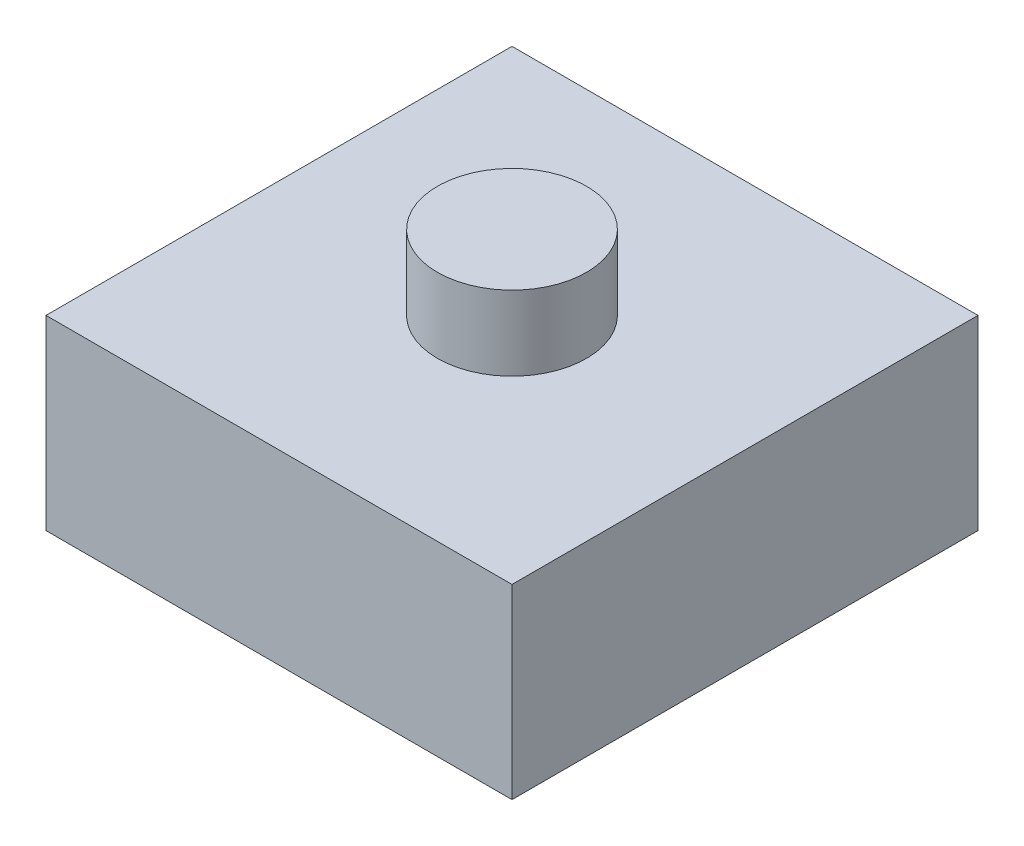
ISO-10303-21;
HEADER;
FILE_DESCRIPTION(('STEP AP214'),'2;1');
FILE_NAME('part.step','',(''),(''),'','','');
FILE_SCHEMA(('AUTOMOTIVE_DESIGN { 1 0 10303 214 1 1 1 1 }'));
ENDSEC;
DATA;
#1=APPLICATION_CONTEXT('core data for automotive mechanical design processes');
#2=APPLICATION_PROTOCOL_DEFINITION('international standard','automotive_design',2000,#1);
#3=PRODUCT_CONTEXT('',#1,'mechanical');
#4=PRODUCT('Part','Part','',(#3));
#5=PRODUCT_RELATED_PRODUCT_CATEGORY('part','',(#4));
#6=PRODUCT_DEFINITION_FORMATION('','',#4);
#7=PRODUCT_DEFINITION_CONTEXT('part definition',#1,'design');
#8=PRODUCT_DEFINITION('design','',#6,#7);
#9=PRODUCT_DEFINITION_SHAPE('','',#8);
#10=(LENGTH_UNIT() NAMED_UNIT(*) SI_UNIT(.MILLI.,.METRE.));
#11=(NAMED_UNIT(*) PLANE_ANGLE_UNIT() SI_UNIT($,.RADIAN.));
#12=(NAMED_UNIT(*) SI_UNIT($,.STERADIAN.) SOLID_ANGLE_UNIT());
#13=UNCERTAINTY_MEASURE_WITH_UNIT(LENGTH_MEASURE(1.E-05),#10,'distance_accuracy_value','');
#14=(GEOMETRIC_REPRESENTATION_CONTEXT(3) GLOBAL_UNCERTAINTY_ASSIGNED_CONTEXT((#13)) GLOBAL_UNIT_ASSIGNED_CONTEXT((#10,
#11,#12)) REPRESENTATION_CONTEXT('',''));
#15=CARTESIAN_POINT('',(0.,0.,0.));
#16=DIRECTION('',(0.,0.,1.));
#17=DIRECTION('',(1.,0.,0.));
#18=AXIS2_PLACEMENT_3D('',#15,#16,#17);
#19=CARTESIAN_POINT('',(12.5,10.,12.5));
#20=DIRECTION('',(-1.,0.,0.));
#21=DIRECTION('',(0.,0.,1.));
#22=AXIS2_PLACEMENT_3D('',#19,#20,#21);
#23=PLANE('',#22);
#24=DIRECTION('',(0.,0.,-1.));
#25=VECTOR('',#24,1.);
#26=CARTESIAN_POINT('',(12.5,0.,12.5));
#27=LINE('',#26,#25);
#28=CARTESIAN_POINT('',(12.5,0.,12.5));
#29=VERTEX_POINT('',#28);
#30=CARTESIAN_POINT('',(12.5,0.,-12.5));
#31=VERTEX_POINT('',#30);
#32=EDGE_CURVE('E98',#29,#31,#27,.T.);
#33=ORIENTED_EDGE('',*,*,#32,.T.);
#34=DIRECTION('',(0.,-1.,0.));
#35=VECTOR('',#34,1.);
#36=CARTESIAN_POINT('',(12.5,10.,-12.5));
#37=LINE('',#36,#35);
#38=CARTESIAN_POINT('',(12.5,10.,-12.5));
#39=VERTEX_POINT('',#38);
#40=EDGE_CURVE('E35',#39,#31,#37,.T.);
#41=ORIENTED_EDGE('',*,*,#40,.F.);
#42=DIRECTION('',(0.,0.,-1.));
#43=VECTOR('',#42,1.);
#44=CARTESIAN_POINT('',(12.5,10.,12.5));
#45=LINE('',#44,#43);
#46=CARTESIAN_POINT('',(12.5,10.,12.5));
#47=VERTEX_POINT('',#46);
#48=EDGE_CURVE('E85',#47,#39,#45,.T.);
#49=ORIENTED_EDGE('',*,*,#48,.F.);
#50=DIRECTION('',(0.,-1.,0.));
#51=VECTOR('',#50,1.);
#52=CARTESIAN_POINT('',(12.5,10.,12.5));
#53=LINE('',#52,#51);
#54=EDGE_CURVE('E94',#47,#29,#53,.T.);
#55=ORIENTED_EDGE('',*,*,#54,.T.);
#56=EDGE_LOOP('',(#33,#41,#49,#55));
#57=FACE_BOUND('',#56,.T.);
#58=ADVANCED_FACE('F32',(#57),#23,.F.);
#59=CARTESIAN_POINT('',(-12.5,10.,-12.5));
#60=DIRECTION('',(0.,0.,1.));
#61=DIRECTION('',(1.,0.,0.));
#62=AXIS2_PLACEMENT_3D('',#59,#60,#61);
#63=PLANE('',#62);
#64=DIRECTION('',(-1.,0.,0.));
#65=VECTOR('',#64,1.);
#66=CARTESIAN_POINT('',(-12.5,0.,-12.5));
#67=LINE('',#66,#65);
#68=CARTESIAN_POINT('',(-12.5,0.,-12.5));
#69=VERTEX_POINT('',#68);
#70=EDGE_CURVE('E90',#31,#69,#67,.T.);
#71=ORIENTED_EDGE('',*,*,#70,.T.);
#72=DIRECTION('',(0.,-1.,0.));
#73=VECTOR('',#72,1.);
#74=CARTESIAN_POINT('',(-12.5,10.,-12.5));
#75=LINE('',#74,#73);
#76=CARTESIAN_POINT('',(-12.5,10.,-12.5));
#77=VERTEX_POINT('',#76);
#78=EDGE_CURVE('E88',#77,#69,#75,.T.);
#79=ORIENTED_EDGE('',*,*,#78,.F.);
#80=DIRECTION('',(-1.,0.,0.));
#81=VECTOR('',#80,1.);
#82=CARTESIAN_POINT('',(-12.5,10.,-12.5));
#83=LINE('',#82,#81);
#84=EDGE_CURVE('E80',#39,#77,#83,.T.);
#85=ORIENTED_EDGE('',*,*,#84,.F.);
#86=ORIENTED_EDGE('',*,*,#40,.T.);
#87=EDGE_LOOP('',(#71,#79,#85,#86));
#88=FACE_BOUND('',#87,.T.);
#89=ADVANCED_FACE('F89',(#88),#63,.F.);
#90=CARTESIAN_POINT('',(-12.5,10.,12.5));
#91=DIRECTION('',(1.,0.,0.));
#92=DIRECTION('',(0.,0.,-1.));
#93=AXIS2_PLACEMENT_3D('',#90,#91,#92);
#94=PLANE('',#93);
#95=DIRECTION('',(0.,0.,1.));
#96=VECTOR('',#95,1.);
#97=CARTESIAN_POINT('',(-12.5,0.,12.5));
#98=LINE('',#97,#96);
#99=CARTESIAN_POINT('',(-12.5,0.,12.5));
#100=VERTEX_POINT('',#99);
#101=EDGE_CURVE('E66',#69,#100,#98,.T.);
#102=ORIENTED_EDGE('',*,*,#101,.T.);
#103=DIRECTION('',(0.,-1.,0.));
#104=VECTOR('',#103,1.);
#105=CARTESIAN_POINT('',(-12.5,10.,12.5));
#106=LINE('',#105,#104);
#107=CARTESIAN_POINT('',(-12.5,10.,12.5));
#108=VERTEX_POINT('',#107);
#109=EDGE_CURVE('E91',#108,#100,#106,.T.);
#110=ORIENTED_EDGE('',*,*,#109,.F.);
#111=DIRECTION('',(0.,0.,1.));
#112=VECTOR('',#111,1.);
#113=CARTESIAN_POINT('',(-12.5,10.,12.5));
#114=LINE('',#113,#112);
#115=EDGE_CURVE('E83',#77,#108,#114,.T.);
#116=ORIENTED_EDGE('',*,*,#115,.F.);
#117=ORIENTED_EDGE('',*,*,#78,.T.);
#118=EDGE_LOOP('',(#102,#110,#116,#117));
#119=FACE_BOUND('',#118,.T.);
#120=ADVANCED_FACE('F92',(#119),#94,.F.);
#121=CARTESIAN_POINT('',(-12.5,10.,12.5));
#122=DIRECTION('',(0.,0.,-1.));
#123=DIRECTION('',(-1.,0.,0.));
#124=AXIS2_PLACEMENT_3D('',#121,#122,#123);
#125=PLANE('',#124);
#126=DIRECTION('',(1.,0.,0.));
#127=VECTOR('',#126,1.);
#128=CARTESIAN_POINT('',(-12.5,0.,12.5));
#129=LINE('',#128,#127);
#130=EDGE_CURVE('E72',#100,#29,#129,.T.);
#131=ORIENTED_EDGE('',*,*,#130,.T.);
#132=ORIENTED_EDGE('',*,*,#54,.F.);
#133=DIRECTION('',(1.,0.,0.));
#134=VECTOR('',#133,1.);
#135=CARTESIAN_POINT('',(-12.5,10.,12.5));
#136=LINE('',#135,#134);
#137=EDGE_CURVE('E49',#108,#47,#136,.T.);
#138=ORIENTED_EDGE('',*,*,#137,.F.);
#139=ORIENTED_EDGE('',*,*,#109,.T.);
#140=EDGE_LOOP('',(#131,#132,#138,#139));
#141=FACE_BOUND('',#140,.T.);
#142=ADVANCED_FACE('F106',(#141),#125,.F.);
#143=CARTESIAN_POINT('',(0.,10.,0.));
#144=DIRECTION('',(0.,-1.,0.));
#145=DIRECTION('',(0.,0.,-1.));
#146=AXIS2_PLACEMENT_3D('',#143,#144,#145);
#147=PLANE('',#146);
#148=CARTESIAN_POINT('',(0.,10.,0.));
#149=DIRECTION('',(0.,1.,0.));
#150=DIRECTION('',(0.,0.,1.));
#151=AXIS2_PLACEMENT_3D('',#148,#149,#150);
#152=CIRCLE('',#151,4.);
#153=CARTESIAN_POINT('',(0.,10.,4.));
#154=VERTEX_POINT('',#153);
#155=EDGE_CURVE('E11',#154,#154,#152,.T.);
#156=ORIENTED_EDGE('',*,*,#155,.F.);
#157=EDGE_LOOP('',(#156));
#158=FACE_BOUND('',#157,.T.);
#159=ORIENTED_EDGE('',*,*,#48,.T.);
#160=ORIENTED_EDGE('',*,*,#84,.T.);
#161=ORIENTED_EDGE('',*,*,#115,.T.);
#162=ORIENTED_EDGE('',*,*,#137,.T.);
#163=EDGE_LOOP('',(#159,#160,#161,#162));
#164=FACE_BOUND('',#163,.T.);
#165=ADVANCED_FACE('F81',(#158,#164),#147,.F.);
#166=CARTESIAN_POINT('',(0.,0.,0.));
#167=DIRECTION('',(0.,-1.,0.));
#168=DIRECTION('',(0.,0.,-1.));
#169=AXIS2_PLACEMENT_3D('',#166,#167,#168);
#170=PLANE('',#169);
#171=ORIENTED_EDGE('',*,*,#32,.F.);
#172=ORIENTED_EDGE('',*,*,#130,.F.);
#173=ORIENTED_EDGE('',*,*,#101,.F.);
#174=ORIENTED_EDGE('',*,*,#70,.F.);
#175=EDGE_LOOP('',(#171,#172,#173,#174));
#176=FACE_BOUND('',#175,.T.);
#177=ADVANCED_FACE('F109',(#176),#170,.T.);
#178=CARTESIAN_POINT('',(0.,14.,0.));
#179=DIRECTION('',(0.,-1.,0.));
#180=DIRECTION('',(0.,0.,-1.));
#181=AXIS2_PLACEMENT_3D('',#178,#179,#180);
#182=CYLINDRICAL_SURFACE('',#181,4.);
#183=CARTESIAN_POINT('',(0.,14.,0.));
#184=DIRECTION('',(0.,1.,0.));
#185=DIRECTION('',(0.,0.,1.));
#186=AXIS2_PLACEMENT_3D('',#183,#184,#185);
#187=CIRCLE('',#186,4.);
#188=CARTESIAN_POINT('',(0.,14.,4.));
#189=VERTEX_POINT('',#188);
#190=EDGE_CURVE('E101',#189,#189,#187,.T.);
#191=ORIENTED_EDGE('',*,*,#190,.F.);
#192=EDGE_LOOP('',(#191));
#193=FACE_BOUND('',#192,.T.);
#194=ORIENTED_EDGE('',*,*,#155,.T.);
#195=EDGE_LOOP('',(#194));
#196=FACE_BOUND('',#195,.T.);
#197=ADVANCED_FACE('F117',(#193,#196),#182,.T.);
#198=CARTESIAN_POINT('',(0.,14.,0.));
#199=DIRECTION('',(0.,1.,0.));
#200=DIRECTION('',(0.,0.,1.));
#201=AXIS2_PLACEMENT_3D('',#198,#199,#200);
#202=PLANE('',#201);
#203=ORIENTED_EDGE('',*,*,#190,.T.);
#204=EDGE_LOOP('',(#203));
#205=FACE_BOUND('',#204,.T.);
#206=ADVANCED_FACE('F115',(#205),#202,.T.);
#207=CLOSED_SHELL('',(#58,#89,#120,#142,#165,#177,#197,#206));
#208=MANIFOLD_SOLID_BREP('B2',#207);
#209=ADVANCED_BREP_SHAPE_REPRESENTATION('',(#18,#208),#14);
#210=SHAPE_DEFINITION_REPRESENTATION(#9,#209);
ENDSEC;
END-ISO-10303-21;
